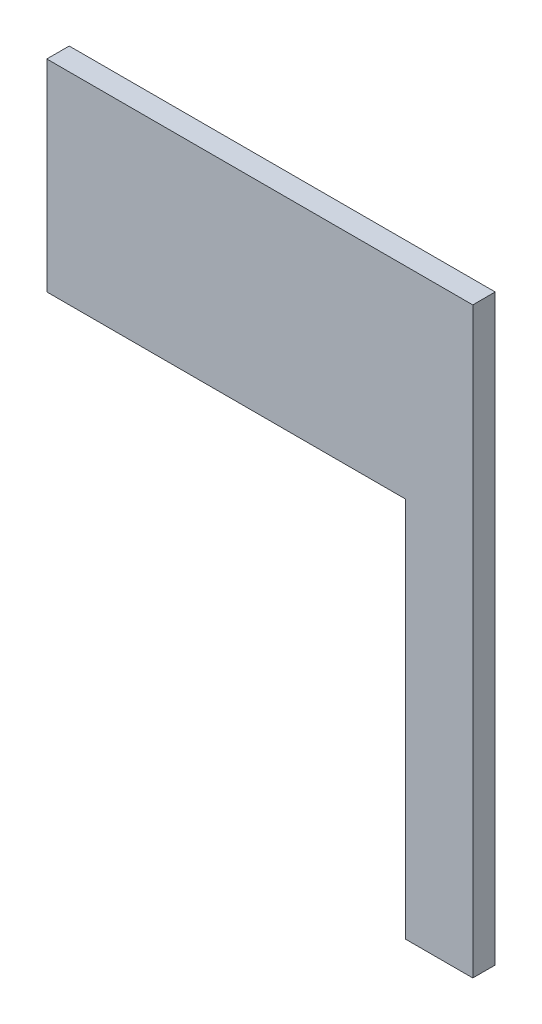
ISO-10303-21;
HEADER;
FILE_DESCRIPTION(('STEP AP214'),'2;1');
FILE_NAME('part.step','',(''),(''),'','','');
FILE_SCHEMA(('AUTOMOTIVE_DESIGN { 1 0 10303 214 1 1 1 1 }'));
ENDSEC;
DATA;
#1=APPLICATION_CONTEXT('core data for automotive mechanical design processes');
#2=APPLICATION_PROTOCOL_DEFINITION('international standard','automotive_design',2000,#1);
#3=PRODUCT_CONTEXT('',#1,'mechanical');
#4=PRODUCT('Part','Part','',(#3));
#5=PRODUCT_RELATED_PRODUCT_CATEGORY('part','',(#4));
#6=PRODUCT_DEFINITION_FORMATION('','',#4);
#7=PRODUCT_DEFINITION_CONTEXT('part definition',#1,'design');
#8=PRODUCT_DEFINITION('design','',#6,#7);
#9=PRODUCT_DEFINITION_SHAPE('','',#8);
#10=(LENGTH_UNIT() NAMED_UNIT(*) SI_UNIT(.MILLI.,.METRE.));
#11=(NAMED_UNIT(*) PLANE_ANGLE_UNIT() SI_UNIT($,.RADIAN.));
#12=(NAMED_UNIT(*) SI_UNIT($,.STERADIAN.) SOLID_ANGLE_UNIT());
#13=UNCERTAINTY_MEASURE_WITH_UNIT(LENGTH_MEASURE(1.E-05),#10,'distance_accuracy_value','');
#14=(GEOMETRIC_REPRESENTATION_CONTEXT(3) GLOBAL_UNCERTAINTY_ASSIGNED_CONTEXT((#13)) GLOBAL_UNIT_ASSIGNED_CONTEXT((#10,
#11,#12)) REPRESENTATION_CONTEXT('',''));
#15=CARTESIAN_POINT('',(0.,0.,0.));
#16=DIRECTION('',(0.,0.,1.));
#17=DIRECTION('',(1.,0.,0.));
#18=AXIS2_PLACEMENT_3D('',#15,#16,#17);
#19=CARTESIAN_POINT('',(0.,0.,5.));
#20=DIRECTION('',(1.,0.,0.));
#21=DIRECTION('',(0.,0.,-1.));
#22=AXIS2_PLACEMENT_3D('',#19,#20,#21);
#23=PLANE('',#22);
#24=DIRECTION('',(0.,-1.,0.));
#25=VECTOR('',#24,1.);
#26=CARTESIAN_POINT('',(0.,0.,0.));
#27=LINE('',#26,#25);
#28=CARTESIAN_POINT('',(0.,45.,0.));
#29=VERTEX_POINT('',#28);
#30=CARTESIAN_POINT('',(0.,0.,0.));
#31=VERTEX_POINT('',#30);
#32=EDGE_CURVE('E122',#29,#31,#27,.T.);
#33=ORIENTED_EDGE('',*,*,#32,.T.);
#34=DIRECTION('',(0.,0.,-1.));
#35=VECTOR('',#34,1.);
#36=CARTESIAN_POINT('',(0.,0.,5.));
#37=LINE('',#36,#35);
#38=CARTESIAN_POINT('',(0.,0.,5.));
#39=VERTEX_POINT('',#38);
#40=EDGE_CURVE('E11',#39,#31,#37,.T.);
#41=ORIENTED_EDGE('',*,*,#40,.F.);
#42=DIRECTION('',(0.,-1.,0.));
#43=VECTOR('',#42,1.);
#44=CARTESIAN_POINT('',(0.,0.,5.));
#45=LINE('',#44,#43);
#46=CARTESIAN_POINT('',(0.,45.,5.));
#47=VERTEX_POINT('',#46);
#48=EDGE_CURVE('E133',#47,#39,#45,.T.);
#49=ORIENTED_EDGE('',*,*,#48,.F.);
#50=DIRECTION('',(0.,0.,-1.));
#51=VECTOR('',#50,1.);
#52=CARTESIAN_POINT('',(0.,45.,5.));
#53=LINE('',#52,#51);
#54=EDGE_CURVE('E118',#47,#29,#53,.T.);
#55=ORIENTED_EDGE('',*,*,#54,.T.);
#56=EDGE_LOOP('',(#33,#41,#49,#55));
#57=FACE_BOUND('',#56,.T.);
#58=ADVANCED_FACE('F37',(#57),#23,.F.);
#59=CARTESIAN_POINT('',(0.,0.,5.));
#60=DIRECTION('',(0.,1.,0.));
#61=DIRECTION('',(0.,0.,1.));
#62=AXIS2_PLACEMENT_3D('',#59,#60,#61);
#63=PLANE('',#62);
#64=DIRECTION('',(1.,0.,0.));
#65=VECTOR('',#64,1.);
#66=CARTESIAN_POINT('',(0.,0.,0.));
#67=LINE('',#66,#65);
#68=CARTESIAN_POINT('',(80.,0.,0.));
#69=VERTEX_POINT('',#68);
#70=EDGE_CURVE('E125',#31,#69,#67,.T.);
#71=ORIENTED_EDGE('',*,*,#70,.T.);
#72=DIRECTION('',(0.,0.,-1.));
#73=VECTOR('',#72,1.);
#74=CARTESIAN_POINT('',(80.,0.,5.));
#75=LINE('',#74,#73);
#76=CARTESIAN_POINT('',(80.,0.,5.));
#77=VERTEX_POINT('',#76);
#78=EDGE_CURVE('E45',#77,#69,#75,.T.);
#79=ORIENTED_EDGE('',*,*,#78,.F.);
#80=DIRECTION('',(1.,0.,0.));
#81=VECTOR('',#80,1.);
#82=CARTESIAN_POINT('',(0.,0.,5.));
#83=LINE('',#82,#81);
#84=EDGE_CURVE('E88',#39,#77,#83,.T.);
#85=ORIENTED_EDGE('',*,*,#84,.F.);
#86=ORIENTED_EDGE('',*,*,#40,.T.);
#87=EDGE_LOOP('',(#71,#79,#85,#86));
#88=FACE_BOUND('',#87,.T.);
#89=ADVANCED_FACE('F147',(#88),#63,.F.);
#90=CARTESIAN_POINT('',(80.,0.,5.));
#91=DIRECTION('',(1.,0.,0.));
#92=DIRECTION('',(0.,1.,0.));
#93=AXIS2_PLACEMENT_3D('',#90,#91,#92);
#94=PLANE('',#93);
#95=DIRECTION('',(0.,-1.,0.));
#96=VECTOR('',#95,1.);
#97=CARTESIAN_POINT('',(80.,0.,0.));
#98=LINE('',#97,#96);
#99=CARTESIAN_POINT('',(80.,-85.,0.));
#100=VERTEX_POINT('',#99);
#101=EDGE_CURVE('E127',#69,#100,#98,.T.);
#102=ORIENTED_EDGE('',*,*,#101,.T.);
#103=DIRECTION('',(0.,0.,-1.));
#104=VECTOR('',#103,1.);
#105=CARTESIAN_POINT('',(80.,-85.,5.));
#106=LINE('',#105,#104);
#107=CARTESIAN_POINT('',(80.,-85.,5.));
#108=VERTEX_POINT('',#107);
#109=EDGE_CURVE('E113',#108,#100,#106,.T.);
#110=ORIENTED_EDGE('',*,*,#109,.F.);
#111=DIRECTION('',(0.,-1.,0.));
#112=VECTOR('',#111,1.);
#113=CARTESIAN_POINT('',(80.,0.,5.));
#114=LINE('',#113,#112);
#115=EDGE_CURVE('E102',#77,#108,#114,.T.);
#116=ORIENTED_EDGE('',*,*,#115,.F.);
#117=ORIENTED_EDGE('',*,*,#78,.T.);
#118=EDGE_LOOP('',(#102,#110,#116,#117));
#119=FACE_BOUND('',#118,.T.);
#120=ADVANCED_FACE('F139',(#119),#94,.F.);
#121=CARTESIAN_POINT('',(95.,-85.,5.));
#122=DIRECTION('',(0.,1.,0.));
#123=DIRECTION('',(0.,0.,1.));
#124=AXIS2_PLACEMENT_3D('',#121,#122,#123);
#125=PLANE('',#124);
#126=DIRECTION('',(1.,0.,0.));
#127=VECTOR('',#126,1.);
#128=CARTESIAN_POINT('',(95.,-85.,0.));
#129=LINE('',#128,#127);
#130=CARTESIAN_POINT('',(95.,-85.,0.));
#131=VERTEX_POINT('',#130);
#132=EDGE_CURVE('E111',#100,#131,#129,.T.);
#133=ORIENTED_EDGE('',*,*,#132,.T.);
#134=DIRECTION('',(0.,0.,-1.));
#135=VECTOR('',#134,1.);
#136=CARTESIAN_POINT('',(95.,-85.,5.));
#137=LINE('',#136,#135);
#138=CARTESIAN_POINT('',(95.,-85.,5.));
#139=VERTEX_POINT('',#138);
#140=EDGE_CURVE('E108',#139,#131,#137,.T.);
#141=ORIENTED_EDGE('',*,*,#140,.F.);
#142=DIRECTION('',(1.,0.,0.));
#143=VECTOR('',#142,1.);
#144=CARTESIAN_POINT('',(95.,-85.,5.));
#145=LINE('',#144,#143);
#146=EDGE_CURVE('E95',#108,#139,#145,.T.);
#147=ORIENTED_EDGE('',*,*,#146,.F.);
#148=ORIENTED_EDGE('',*,*,#109,.T.);
#149=EDGE_LOOP('',(#133,#141,#147,#148));
#150=FACE_BOUND('',#149,.T.);
#151=ADVANCED_FACE('F109',(#150),#125,.F.);
#152=CARTESIAN_POINT('',(95.,45.,5.));
#153=DIRECTION('',(-1.,0.,0.));
#154=DIRECTION('',(0.,0.,1.));
#155=AXIS2_PLACEMENT_3D('',#152,#153,#154);
#156=PLANE('',#155);
#157=DIRECTION('',(0.,1.,0.));
#158=VECTOR('',#157,1.);
#159=CARTESIAN_POINT('',(95.,45.,0.));
#160=LINE('',#159,#158);
#161=CARTESIAN_POINT('',(95.,45.,0.));
#162=VERTEX_POINT('',#161);
#163=EDGE_CURVE('E130',#131,#162,#160,.T.);
#164=ORIENTED_EDGE('',*,*,#163,.T.);
#165=DIRECTION('',(0.,0.,-1.));
#166=VECTOR('',#165,1.);
#167=CARTESIAN_POINT('',(95.,45.,5.));
#168=LINE('',#167,#166);
#169=CARTESIAN_POINT('',(95.,45.,5.));
#170=VERTEX_POINT('',#169);
#171=EDGE_CURVE('E114',#170,#162,#168,.T.);
#172=ORIENTED_EDGE('',*,*,#171,.F.);
#173=DIRECTION('',(0.,1.,0.));
#174=VECTOR('',#173,1.);
#175=CARTESIAN_POINT('',(95.,45.,5.));
#176=LINE('',#175,#174);
#177=EDGE_CURVE('E99',#139,#170,#176,.T.);
#178=ORIENTED_EDGE('',*,*,#177,.F.);
#179=ORIENTED_EDGE('',*,*,#140,.T.);
#180=EDGE_LOOP('',(#164,#172,#178,#179));
#181=FACE_BOUND('',#180,.T.);
#182=ADVANCED_FACE('F116',(#181),#156,.F.);
#183=CARTESIAN_POINT('',(0.,45.,5.));
#184=DIRECTION('',(0.,-1.,0.));
#185=DIRECTION('',(0.,0.,-1.));
#186=AXIS2_PLACEMENT_3D('',#183,#184,#185);
#187=PLANE('',#186);
#188=DIRECTION('',(-1.,0.,0.));
#189=VECTOR('',#188,1.);
#190=CARTESIAN_POINT('',(0.,45.,0.));
#191=LINE('',#190,#189);
#192=EDGE_CURVE('E76',#162,#29,#191,.T.);
#193=ORIENTED_EDGE('',*,*,#192,.T.);
#194=ORIENTED_EDGE('',*,*,#54,.F.);
#195=DIRECTION('',(-1.,0.,0.));
#196=VECTOR('',#195,1.);
#197=CARTESIAN_POINT('',(85.,45.,5.));
#198=LINE('',#197,#196);
#199=EDGE_CURVE('E53',#170,#47,#198,.T.);
#200=ORIENTED_EDGE('',*,*,#199,.F.);
#201=ORIENTED_EDGE('',*,*,#171,.T.);
#202=EDGE_LOOP('',(#193,#194,#200,#201));
#203=FACE_BOUND('',#202,.T.);
#204=ADVANCED_FACE('F141',(#203),#187,.F.);
#205=CARTESIAN_POINT('',(0.,0.,5.));
#206=DIRECTION('',(0.,0.,-1.));
#207=DIRECTION('',(-1.,0.,0.));
#208=AXIS2_PLACEMENT_3D('',#205,#206,#207);
#209=PLANE('',#208);
#210=ORIENTED_EDGE('',*,*,#48,.T.);
#211=ORIENTED_EDGE('',*,*,#84,.T.);
#212=ORIENTED_EDGE('',*,*,#115,.T.);
#213=ORIENTED_EDGE('',*,*,#146,.T.);
#214=ORIENTED_EDGE('',*,*,#177,.T.);
#215=ORIENTED_EDGE('',*,*,#199,.T.);
#216=EDGE_LOOP('',(#210,#211,#212,#213,#214,#215));
#217=FACE_BOUND('',#216,.T.);
#218=ADVANCED_FACE('F97',(#217),#209,.F.);
#219=CARTESIAN_POINT('',(0.,0.,0.));
#220=DIRECTION('',(0.,0.,-1.));
#221=DIRECTION('',(-1.,0.,0.));
#222=AXIS2_PLACEMENT_3D('',#219,#220,#221);
#223=PLANE('',#222);
#224=ORIENTED_EDGE('',*,*,#32,.F.);
#225=ORIENTED_EDGE('',*,*,#192,.F.);
#226=ORIENTED_EDGE('',*,*,#163,.F.);
#227=ORIENTED_EDGE('',*,*,#132,.F.);
#228=ORIENTED_EDGE('',*,*,#101,.F.);
#229=ORIENTED_EDGE('',*,*,#70,.F.);
#230=EDGE_LOOP('',(#224,#225,#226,#227,#228,#229));
#231=FACE_BOUND('',#230,.T.);
#232=ADVANCED_FACE('F140',(#231),#223,.T.);
#233=CLOSED_SHELL('',(#58,#89,#120,#151,#182,#204,#218,#232));
#234=MANIFOLD_SOLID_BREP('B2',#233);
#235=ADVANCED_BREP_SHAPE_REPRESENTATION('',(#18,#234),#14);
#236=SHAPE_DEFINITION_REPRESENTATION(#9,#235);
ENDSEC;
END-ISO-10303-21;
